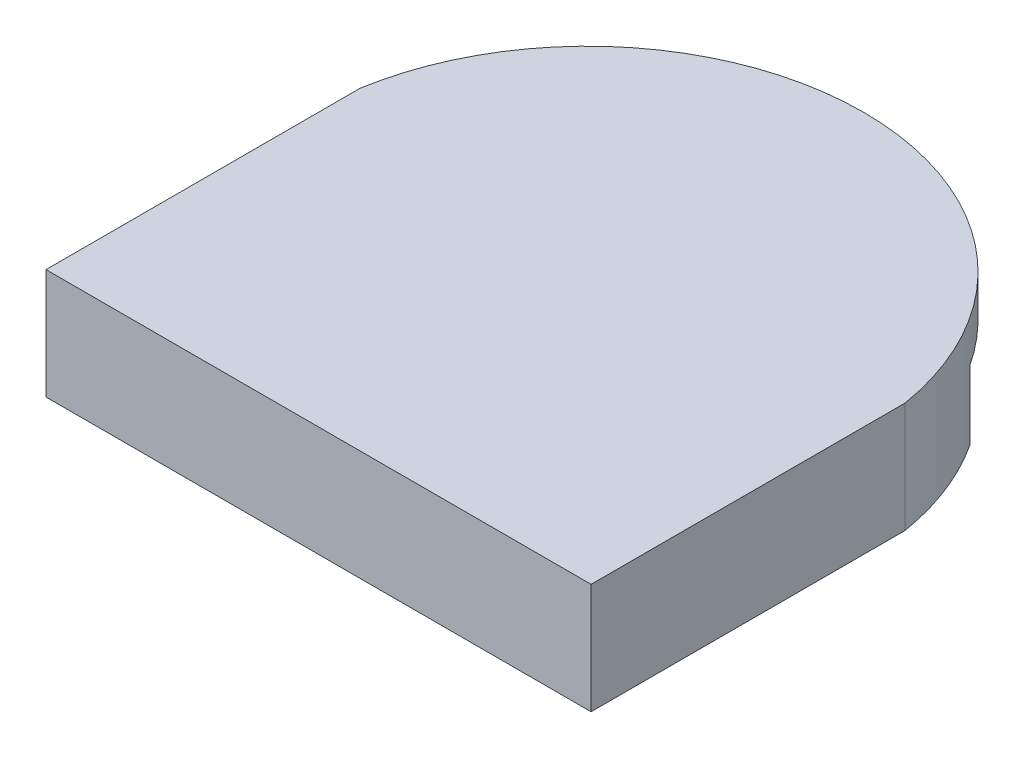
ISO-10303-21;
HEADER;
FILE_DESCRIPTION(('STEP AP214'),'2;1');
FILE_NAME('part.step','',(''),(''),'','','');
FILE_SCHEMA(('AUTOMOTIVE_DESIGN { 1 0 10303 214 1 1 1 1 }'));
ENDSEC;
DATA;
#1=APPLICATION_CONTEXT('core data for automotive mechanical design processes');
#2=APPLICATION_PROTOCOL_DEFINITION('international standard','automotive_design',2000,#1);
#3=PRODUCT_CONTEXT('',#1,'mechanical');
#4=PRODUCT('Part','Part','',(#3));
#5=PRODUCT_RELATED_PRODUCT_CATEGORY('part','',(#4));
#6=PRODUCT_DEFINITION_FORMATION('','',#4);
#7=PRODUCT_DEFINITION_CONTEXT('part definition',#1,'design');
#8=PRODUCT_DEFINITION('design','',#6,#7);
#9=PRODUCT_DEFINITION_SHAPE('','',#8);
#10=(LENGTH_UNIT() NAMED_UNIT(*) SI_UNIT(.MILLI.,.METRE.));
#11=(NAMED_UNIT(*) PLANE_ANGLE_UNIT() SI_UNIT($,.RADIAN.));
#12=(NAMED_UNIT(*) SI_UNIT($,.STERADIAN.) SOLID_ANGLE_UNIT());
#13=UNCERTAINTY_MEASURE_WITH_UNIT(LENGTH_MEASURE(1.E-05),#10,'distance_accuracy_value','');
#14=(GEOMETRIC_REPRESENTATION_CONTEXT(3) GLOBAL_UNCERTAINTY_ASSIGNED_CONTEXT((#13)) GLOBAL_UNIT_ASSIGNED_CONTEXT((#10,
#11,#12)) REPRESENTATION_CONTEXT('',''));
#15=CARTESIAN_POINT('',(0.,0.,0.));
#16=DIRECTION('',(0.,0.,1.));
#17=DIRECTION('',(1.,0.,0.));
#18=AXIS2_PLACEMENT_3D('',#15,#16,#17);
#19=CARTESIAN_POINT('',(1.88196721311474,0.,7.9));
#20=DIRECTION('',(1.,0.,0.));
#21=DIRECTION('',(0.,0.,-1.));
#22=AXIS2_PLACEMENT_3D('',#19,#20,#21);
#23=PLANE('',#22);
#24=DIRECTION('',(0.,0.,-1.));
#25=VECTOR('',#24,1.);
#26=CARTESIAN_POINT('',(1.88196721311474,0.,7.9));
#27=LINE('',#26,#25);
#28=CARTESIAN_POINT('',(1.88196721311474,0.,6.7));
#29=VERTEX_POINT('',#28);
#30=CARTESIAN_POINT('',(1.88196721311474,0.,0.));
#31=VERTEX_POINT('',#30);
#32=EDGE_CURVE('E272',#29,#31,#27,.T.);
#33=ORIENTED_EDGE('',*,*,#32,.T.);
#34=DIRECTION('',(0.,1.,0.));
#35=VECTOR('',#34,1.);
#36=CARTESIAN_POINT('',(1.88196721311474,0.,0.));
#37=LINE('',#36,#35);
#38=CARTESIAN_POINT('',(1.88196721311474,2.,0.));
#39=VERTEX_POINT('',#38);
#40=EDGE_CURVE('E191',#31,#39,#37,.T.);
#41=ORIENTED_EDGE('',*,*,#40,.T.);
#42=DIRECTION('',(0.,0.,-1.));
#43=VECTOR('',#42,1.);
#44=CARTESIAN_POINT('',(1.88196721311474,2.,7.9));
#45=LINE('',#44,#43);
#46=CARTESIAN_POINT('',(1.88196721311474,2.,6.7));
#47=VERTEX_POINT('',#46);
#48=EDGE_CURVE('E262',#47,#39,#45,.T.);
#49=ORIENTED_EDGE('',*,*,#48,.F.);
#50=DIRECTION('',(0.,-1.,0.));
#51=VECTOR('',#50,1.);
#52=CARTESIAN_POINT('',(1.88196721311474,0.,6.7));
#53=LINE('',#52,#51);
#54=EDGE_CURVE('E259',#47,#29,#53,.T.);
#55=ORIENTED_EDGE('',*,*,#54,.T.);
#56=EDGE_LOOP('',(#33,#41,#49,#55));
#57=FACE_BOUND('',#56,.T.);
#58=ADVANCED_FACE('F41',(#57),#23,.T.);
#59=CARTESIAN_POINT('',(0.681967213114738,2.,7.9));
#60=DIRECTION('',(0.,-1.,0.));
#61=DIRECTION('',(1.,0.,0.));
#62=AXIS2_PLACEMENT_3D('',#59,#60,#61);
#63=PLANE('',#62);
#64=DIRECTION('',(-0.707106781186548,0.,-0.707106781186548));
#65=VECTOR('',#64,1.);
#66=CARTESIAN_POINT('',(4.36541319002874,2.,-6.7));
#67=LINE('',#66,#65);
#68=CARTESIAN_POINT('',(5.24962682858902,2.,-5.81578636143971));
#69=VERTEX_POINT('',#68);
#70=CARTESIAN_POINT('',(4.36541319002874,2.,-6.7));
#71=VERTEX_POINT('',#70);
#72=EDGE_CURVE('E182',#69,#71,#67,.T.);
#73=ORIENTED_EDGE('',*,*,#72,.F.);
#74=CARTESIAN_POINT('',(8.57559311453201,2.,-0.00261129878219996));
#75=DIRECTION('',(0.,1.,0.));
#76=DIRECTION('',(0.,0.,-1.));
#77=AXIS2_PLACEMENT_3D('',#74,#75,#76);
#78=CIRCLE('',#77,6.69739173442413);
#79=CARTESIAN_POINT('',(8.58196721311474,2.,-6.7));
#80=VERTEX_POINT('',#79);
#81=EDGE_CURVE('E64',#80,#69,#78,.T.);
#82=ORIENTED_EDGE('',*,*,#81,.F.);
#83=CARTESIAN_POINT('',(8.58196721311474,2.,0.));
#84=DIRECTION('',(0.,1.,0.));
#85=DIRECTION('',(0.,0.,1.));
#86=AXIS2_PLACEMENT_3D('',#83,#84,#85);
#87=CIRCLE('',#86,6.7);
#88=CARTESIAN_POINT('',(11.9122376651536,2.,-5.81371642895289));
#89=VERTEX_POINT('',#88);
#90=EDGE_CURVE('E201',#89,#80,#87,.T.);
#91=ORIENTED_EDGE('',*,*,#90,.F.);
#92=DIRECTION('',(-0.707106781186547,0.,0.707106781186548));
#93=VECTOR('',#92,1.);
#94=CARTESIAN_POINT('',(12.7985212362007,2.,-6.7));
#95=LINE('',#94,#93);
#96=CARTESIAN_POINT('',(12.7985212362007,2.,-6.7));
#97=VERTEX_POINT('',#96);
#98=EDGE_CURVE('E206',#97,#89,#95,.T.);
#99=ORIENTED_EDGE('',*,*,#98,.F.);
#100=CARTESIAN_POINT('',(8.58196721311474,2.,0.108053262334495));
#101=DIRECTION('',(0.,-1.,0.));
#102=DIRECTION('',(1.,0.,0.));
#103=AXIS2_PLACEMENT_3D('',#100,#101,#102);
#104=CIRCLE('',#103,8.0080532623345);
#105=CARTESIAN_POINT('',(15.2819672131147,2.,-4.27816573041839));
#106=VERTEX_POINT('',#105);
#107=EDGE_CURVE('E247',#106,#97,#104,.F.);
#108=ORIENTED_EDGE('',*,*,#107,.F.);
#109=DIRECTION('',(0.707106781186547,0.,-0.707106781186548));
#110=VECTOR('',#109,1.);
#111=CARTESIAN_POINT('',(15.2819672131147,2.,-4.27816573041839));
#112=LINE('',#111,#110);
#113=CARTESIAN_POINT('',(14.3731332158897,2.,-3.36933173319334));
#114=VERTEX_POINT('',#113);
#115=EDGE_CURVE('E222',#114,#106,#112,.T.);
#116=ORIENTED_EDGE('',*,*,#115,.F.);
#117=CARTESIAN_POINT('',(8.58196721311474,2.,0.));
#118=DIRECTION('',(0.,1.,0.));
#119=DIRECTION('',(0.,0.,1.));
#120=AXIS2_PLACEMENT_3D('',#117,#118,#119);
#121=CIRCLE('',#120,6.7);
#122=CARTESIAN_POINT('',(15.2819672131147,2.,0.));
#123=VERTEX_POINT('',#122);
#124=EDGE_CURVE('E215',#123,#114,#121,.T.);
#125=ORIENTED_EDGE('',*,*,#124,.F.);
#126=DIRECTION('',(0.,0.,-1.));
#127=VECTOR('',#126,1.);
#128=CARTESIAN_POINT('',(15.2819672131147,2.,7.9));
#129=LINE('',#128,#127);
#130=CARTESIAN_POINT('',(15.2819672131147,2.,6.7));
#131=VERTEX_POINT('',#130);
#132=EDGE_CURVE('E265',#131,#123,#129,.T.);
#133=ORIENTED_EDGE('',*,*,#132,.F.);
#134=DIRECTION('',(-1.,0.,0.));
#135=VECTOR('',#134,1.);
#136=CARTESIAN_POINT('',(0.,2.,6.7));
#137=LINE('',#136,#135);
#138=EDGE_CURVE('E266',#131,#47,#137,.T.);
#139=ORIENTED_EDGE('',*,*,#138,.T.);
#140=ORIENTED_EDGE('',*,*,#48,.T.);
#141=CARTESIAN_POINT('',(8.58196721311475,2.,0.));
#142=DIRECTION('',(0.,1.,0.));
#143=DIRECTION('',(0.,0.,-1.));
#144=AXIS2_PLACEMENT_3D('',#141,#142,#143);
#145=CIRCLE('',#144,6.70000000000001);
#146=CARTESIAN_POINT('',(2.79080121033979,2.,-3.36933173319334));
#147=VERTEX_POINT('',#146);
#148=EDGE_CURVE('E56',#147,#39,#145,.T.);
#149=ORIENTED_EDGE('',*,*,#148,.F.);
#150=DIRECTION('',(0.707106781186547,0.,0.707106781186548));
#151=VECTOR('',#150,1.);
#152=CARTESIAN_POINT('',(1.88196721311474,2.,-4.27816573041839));
#153=LINE('',#152,#151);
#154=CARTESIAN_POINT('',(1.88196721311474,2.,-4.27816573041839));
#155=VERTEX_POINT('',#154);
#156=EDGE_CURVE('E194',#155,#147,#153,.T.);
#157=ORIENTED_EDGE('',*,*,#156,.F.);
#158=CARTESIAN_POINT('',(8.58196721311474,2.,0.108053262334495));
#159=DIRECTION('',(0.,-1.,0.));
#160=DIRECTION('',(1.,0.,0.));
#161=AXIS2_PLACEMENT_3D('',#158,#159,#160);
#162=CIRCLE('',#161,8.0080532623345);
#163=EDGE_CURVE('E234',#155,#71,#162,.T.);
#164=ORIENTED_EDGE('',*,*,#163,.T.);
#165=EDGE_LOOP('',(#73,#82,#91,#99,#108,#116,#125,#133,#139,#140,#149,#157,#164));
#166=FACE_BOUND('',#165,.T.);
#167=CARTESIAN_POINT('',(8.58196721311474,2.,0.));
#168=DIRECTION('',(0.,-1.,0.));
#169=DIRECTION('',(1.,0.,0.));
#170=AXIS2_PLACEMENT_3D('',#167,#168,#169);
#171=CIRCLE('',#170,3.15);
#172=CARTESIAN_POINT('',(11.7319672131147,2.,0.));
#173=VERTEX_POINT('',#172);
#174=EDGE_CURVE('E258',#173,#173,#171,.F.);
#175=ORIENTED_EDGE('',*,*,#174,.T.);
#176=EDGE_LOOP('',(#175));
#177=FACE_BOUND('',#176,.T.);
#178=ADVANCED_FACE('F311',(#166,#177),#63,.T.);
#179=CARTESIAN_POINT('',(0.681967213114738,0.,7.9));
#180=DIRECTION('',(0.,1.,0.));
#181=DIRECTION('',(0.,0.,1.));
#182=AXIS2_PLACEMENT_3D('',#179,#180,#181);
#183=PLANE('',#182);
#184=CARTESIAN_POINT('',(8.58196721311474,0.,0.));
#185=DIRECTION('',(0.,1.,0.));
#186=DIRECTION('',(0.,0.,1.));
#187=AXIS2_PLACEMENT_3D('',#184,#185,#186);
#188=CIRCLE('',#187,6.7);
#189=CARTESIAN_POINT('',(11.9122376651536,0.,-5.81371642895289));
#190=VERTEX_POINT('',#189);
#191=CARTESIAN_POINT('',(8.58196721311474,0.,-6.7));
#192=VERTEX_POINT('',#191);
#193=EDGE_CURVE('E176',#190,#192,#188,.T.);
#194=ORIENTED_EDGE('',*,*,#193,.T.);
#195=CARTESIAN_POINT('',(8.57559311453201,0.,-0.00261129878219996));
#196=DIRECTION('',(0.,1.,0.));
#197=DIRECTION('',(0.,0.,-1.));
#198=AXIS2_PLACEMENT_3D('',#195,#196,#197);
#199=CIRCLE('',#198,6.69739173442413);
#200=CARTESIAN_POINT('',(5.24962682858902,0.,-5.81578636143971));
#201=VERTEX_POINT('',#200);
#202=EDGE_CURVE('E171',#192,#201,#199,.T.);
#203=ORIENTED_EDGE('',*,*,#202,.T.);
#204=DIRECTION('',(-0.707106781186548,0.,-0.707106781186548));
#205=VECTOR('',#204,1.);
#206=CARTESIAN_POINT('',(4.36541319002874,0.,-6.7));
#207=LINE('',#206,#205);
#208=CARTESIAN_POINT('',(4.36541319002874,0.,-6.7));
#209=VERTEX_POINT('',#208);
#210=EDGE_CURVE('E163',#201,#209,#207,.T.);
#211=ORIENTED_EDGE('',*,*,#210,.T.);
#212=CARTESIAN_POINT('',(8.58196721311474,0.,0.108053262334495));
#213=DIRECTION('',(0.,-1.,0.));
#214=DIRECTION('',(0.,0.,1.));
#215=AXIS2_PLACEMENT_3D('',#212,#213,#214);
#216=CIRCLE('',#215,8.0080532623345);
#217=CARTESIAN_POINT('',(12.7985212362007,0.,-6.7));
#218=VERTEX_POINT('',#217);
#219=EDGE_CURVE('E240',#209,#218,#216,.T.);
#220=ORIENTED_EDGE('',*,*,#219,.T.);
#221=DIRECTION('',(-0.707106781186547,0.,0.707106781186548));
#222=VECTOR('',#221,1.);
#223=CARTESIAN_POINT('',(12.7985212362007,0.,-6.7));
#224=LINE('',#223,#222);
#225=EDGE_CURVE('E200',#218,#190,#224,.T.);
#226=ORIENTED_EDGE('',*,*,#225,.T.);
#227=EDGE_LOOP('',(#194,#203,#211,#220,#226));
#228=FACE_BOUND('',#227,.T.);
#229=ADVANCED_FACE('F174',(#228),#183,.F.);
#230=CARTESIAN_POINT('',(8.58196721311474,0.,0.108053262334495));
#231=DIRECTION('',(0.,1.,0.));
#232=DIRECTION('',(0.,0.,1.));
#233=AXIS2_PLACEMENT_3D('',#230,#231,#232);
#234=CIRCLE('',#233,8.0080532623345);
#235=CARTESIAN_POINT('',(1.88196721311474,0.,-4.27816573041839));
#236=VERTEX_POINT('',#235);
#237=CARTESIAN_POINT('',(0.68196721311474,0.,-1.20302150761043));
#238=VERTEX_POINT('',#237);
#239=EDGE_CURVE('E229',#236,#238,#234,.T.);
#240=ORIENTED_EDGE('',*,*,#239,.F.);
#241=DIRECTION('',(0.707106781186547,0.,0.707106781186548));
#242=VECTOR('',#241,1.);
#243=CARTESIAN_POINT('',(1.88196721311474,0.,-4.27816573041839));
#244=LINE('',#243,#242);
#245=CARTESIAN_POINT('',(2.79080121033979,0.,-3.36933173319334));
#246=VERTEX_POINT('',#245);
#247=EDGE_CURVE('E189',#236,#246,#244,.T.);
#248=ORIENTED_EDGE('',*,*,#247,.T.);
#249=CARTESIAN_POINT('',(8.58196721311475,0.,0.));
#250=DIRECTION('',(0.,1.,0.));
#251=DIRECTION('',(0.,0.,-1.));
#252=AXIS2_PLACEMENT_3D('',#249,#250,#251);
#253=CIRCLE('',#252,6.70000000000001);
#254=EDGE_CURVE('E184',#246,#31,#253,.T.);
#255=ORIENTED_EDGE('',*,*,#254,.T.);
#256=ORIENTED_EDGE('',*,*,#32,.F.);
#257=DIRECTION('',(1.,0.,0.));
#258=VECTOR('',#257,1.);
#259=CARTESIAN_POINT('',(0.,0.,6.7));
#260=LINE('',#259,#258);
#261=CARTESIAN_POINT('',(15.2819672131147,0.,6.7));
#262=VERTEX_POINT('',#261);
#263=EDGE_CURVE('E261',#29,#262,#260,.T.);
#264=ORIENTED_EDGE('',*,*,#263,.T.);
#265=DIRECTION('',(0.,0.,-1.));
#266=VECTOR('',#265,1.);
#267=CARTESIAN_POINT('',(15.2819672131147,0.,7.9));
#268=LINE('',#267,#266);
#269=CARTESIAN_POINT('',(15.2819672131147,0.,0.));
#270=VERTEX_POINT('',#269);
#271=EDGE_CURVE('E270',#262,#270,#268,.T.);
#272=ORIENTED_EDGE('',*,*,#271,.T.);
#273=CARTESIAN_POINT('',(8.58196721311474,0.,0.));
#274=DIRECTION('',(0.,1.,0.));
#275=DIRECTION('',(0.,0.,1.));
#276=AXIS2_PLACEMENT_3D('',#273,#274,#275);
#277=CIRCLE('',#276,6.7);
#278=CARTESIAN_POINT('',(14.3731332158897,0.,-3.36933173319334));
#279=VERTEX_POINT('',#278);
#280=EDGE_CURVE('E211',#270,#279,#277,.T.);
#281=ORIENTED_EDGE('',*,*,#280,.T.);
#282=DIRECTION('',(0.707106781186547,0.,-0.707106781186548));
#283=VECTOR('',#282,1.);
#284=CARTESIAN_POINT('',(15.2819672131147,0.,-4.27816573041839));
#285=LINE('',#284,#283);
#286=CARTESIAN_POINT('',(15.2819672131147,0.,-4.27816573041839));
#287=VERTEX_POINT('',#286);
#288=EDGE_CURVE('E214',#279,#287,#285,.T.);
#289=ORIENTED_EDGE('',*,*,#288,.T.);
#290=CARTESIAN_POINT('',(16.4819672131147,0.,-1.20302150761043));
#291=VERTEX_POINT('',#290);
#292=EDGE_CURVE('E243',#287,#291,#216,.T.);
#293=ORIENTED_EDGE('',*,*,#292,.T.);
#294=DIRECTION('',(0.,0.,-1.));
#295=VECTOR('',#294,1.);
#296=CARTESIAN_POINT('',(16.4819672131147,0.,7.9));
#297=LINE('',#296,#295);
#298=CARTESIAN_POINT('',(16.4819672131147,0.,7.9));
#299=VERTEX_POINT('',#298);
#300=EDGE_CURVE('E294',#299,#291,#297,.T.);
#301=ORIENTED_EDGE('',*,*,#300,.F.);
#302=DIRECTION('',(1.,0.,0.));
#303=VECTOR('',#302,1.);
#304=CARTESIAN_POINT('',(0.681967213114738,0.,7.9));
#305=LINE('',#304,#303);
#306=CARTESIAN_POINT('',(0.681967213114738,0.,7.9));
#307=VERTEX_POINT('',#306);
#308=EDGE_CURVE('E282',#307,#299,#305,.T.);
#309=ORIENTED_EDGE('',*,*,#308,.F.);
#310=DIRECTION('',(0.,0.,-1.));
#311=VECTOR('',#310,1.);
#312=CARTESIAN_POINT('',(0.681967213114738,0.,7.9));
#313=LINE('',#312,#311);
#314=EDGE_CURVE('E297',#307,#238,#313,.T.);
#315=ORIENTED_EDGE('',*,*,#314,.T.);
#316=EDGE_LOOP('',(#240,#248,#255,#256,#264,#272,#281,#289,#293,#301,#309,#315));
#317=FACE_BOUND('',#316,.T.);
#318=ADVANCED_FACE('F329',(#317),#183,.F.);
#319=CARTESIAN_POINT('',(0.681967213114738,0.,7.9));
#320=DIRECTION('',(1.,0.,0.));
#321=DIRECTION('',(0.,0.,-1.));
#322=AXIS2_PLACEMENT_3D('',#319,#320,#321);
#323=PLANE('',#322);
#324=DIRECTION('',(0.,1.,0.));
#325=VECTOR('',#324,1.);
#326=CARTESIAN_POINT('',(0.68196721311474,0.,-1.20302150761043));
#327=LINE('',#326,#325);
#328=CARTESIAN_POINT('',(0.68196721311474,3.2,-1.20302150761043));
#329=VERTEX_POINT('',#328);
#330=EDGE_CURVE('E231',#238,#329,#327,.T.);
#331=ORIENTED_EDGE('',*,*,#330,.F.);
#332=ORIENTED_EDGE('',*,*,#314,.F.);
#333=DIRECTION('',(0.,-1.,0.));
#334=VECTOR('',#333,1.);
#335=CARTESIAN_POINT('',(0.681967213114738,0.,7.9));
#336=LINE('',#335,#334);
#337=CARTESIAN_POINT('',(0.681967213114738,3.2,7.9));
#338=VERTEX_POINT('',#337);
#339=EDGE_CURVE('E275',#338,#307,#336,.T.);
#340=ORIENTED_EDGE('',*,*,#339,.F.);
#341=DIRECTION('',(0.,0.,-1.));
#342=VECTOR('',#341,1.);
#343=CARTESIAN_POINT('',(0.681967213114738,3.2,7.9));
#344=LINE('',#343,#342);
#345=EDGE_CURVE('E288',#338,#329,#344,.T.);
#346=ORIENTED_EDGE('',*,*,#345,.T.);
#347=EDGE_LOOP('',(#331,#332,#340,#346));
#348=FACE_BOUND('',#347,.T.);
#349=ADVANCED_FACE('F43',(#348),#323,.F.);
#350=CARTESIAN_POINT('',(0.681967213114738,3.2,7.9));
#351=DIRECTION('',(0.,-1.,0.));
#352=DIRECTION('',(1.,0.,0.));
#353=AXIS2_PLACEMENT_3D('',#350,#351,#352);
#354=PLANE('',#353);
#355=CARTESIAN_POINT('',(8.58196721311474,3.2,0.108053262334495));
#356=DIRECTION('',(0.,-1.,0.));
#357=DIRECTION('',(0.,0.,1.));
#358=AXIS2_PLACEMENT_3D('',#355,#356,#357);
#359=CIRCLE('',#358,8.0080532623345);
#360=CARTESIAN_POINT('',(16.4819672131147,3.2,-1.20302150761043));
#361=VERTEX_POINT('',#360);
#362=EDGE_CURVE('E239',#329,#361,#359,.T.);
#363=ORIENTED_EDGE('',*,*,#362,.F.);
#364=ORIENTED_EDGE('',*,*,#345,.F.);
#365=DIRECTION('',(-1.,0.,0.));
#366=VECTOR('',#365,1.);
#367=CARTESIAN_POINT('',(0.681967213114738,3.2,7.9));
#368=LINE('',#367,#366);
#369=CARTESIAN_POINT('',(16.4819672131147,3.2,7.9));
#370=VERTEX_POINT('',#369);
#371=EDGE_CURVE('E286',#370,#338,#368,.T.);
#372=ORIENTED_EDGE('',*,*,#371,.F.);
#373=DIRECTION('',(0.,0.,-1.));
#374=VECTOR('',#373,1.);
#375=CARTESIAN_POINT('',(16.4819672131147,3.2,7.9));
#376=LINE('',#375,#374);
#377=EDGE_CURVE('E291',#370,#361,#376,.T.);
#378=ORIENTED_EDGE('',*,*,#377,.T.);
#379=EDGE_LOOP('',(#363,#364,#372,#378));
#380=FACE_BOUND('',#379,.T.);
#381=ADVANCED_FACE('F382',(#380),#354,.F.);
#382=CARTESIAN_POINT('',(16.4819672131147,0.,7.9));
#383=DIRECTION('',(-1.,0.,0.));
#384=DIRECTION('',(0.,0.,1.));
#385=AXIS2_PLACEMENT_3D('',#382,#383,#384);
#386=PLANE('',#385);
#387=ORIENTED_EDGE('',*,*,#300,.T.);
#388=DIRECTION('',(0.,1.,0.));
#389=VECTOR('',#388,1.);
#390=CARTESIAN_POINT('',(16.4819672131147,0.,-1.20302150761043));
#391=LINE('',#390,#389);
#392=EDGE_CURVE('E242',#291,#361,#391,.T.);
#393=ORIENTED_EDGE('',*,*,#392,.T.);
#394=ORIENTED_EDGE('',*,*,#377,.F.);
#395=DIRECTION('',(0.,1.,0.));
#396=VECTOR('',#395,1.);
#397=CARTESIAN_POINT('',(16.4819672131147,0.,7.9));
#398=LINE('',#397,#396);
#399=EDGE_CURVE('E284',#299,#370,#398,.T.);
#400=ORIENTED_EDGE('',*,*,#399,.F.);
#401=EDGE_LOOP('',(#387,#393,#394,#400));
#402=FACE_BOUND('',#401,.T.);
#403=ADVANCED_FACE('F380',(#402),#386,.F.);
#404=CARTESIAN_POINT('',(0.,0.,7.9));
#405=DIRECTION('',(0.,0.,-1.));
#406=DIRECTION('',(-1.,0.,0.));
#407=AXIS2_PLACEMENT_3D('',#404,#405,#406);
#408=PLANE('',#407);
#409=ORIENTED_EDGE('',*,*,#339,.T.);
#410=ORIENTED_EDGE('',*,*,#308,.T.);
#411=ORIENTED_EDGE('',*,*,#399,.T.);
#412=ORIENTED_EDGE('',*,*,#371,.T.);
#413=EDGE_LOOP('',(#409,#410,#411,#412));
#414=FACE_BOUND('',#413,.T.);
#415=ADVANCED_FACE('F373',(#414),#408,.F.);
#416=CARTESIAN_POINT('',(15.2819672131147,0.,7.9));
#417=DIRECTION('',(-1.,0.,0.));
#418=DIRECTION('',(0.,0.,1.));
#419=AXIS2_PLACEMENT_3D('',#416,#417,#418);
#420=PLANE('',#419);
#421=DIRECTION('',(0.,1.,0.));
#422=VECTOR('',#421,1.);
#423=CARTESIAN_POINT('',(15.2819672131147,0.,0.));
#424=LINE('',#423,#422);
#425=EDGE_CURVE('E219',#270,#123,#424,.T.);
#426=ORIENTED_EDGE('',*,*,#425,.F.);
#427=ORIENTED_EDGE('',*,*,#271,.F.);
#428=DIRECTION('',(0.,1.,0.));
#429=VECTOR('',#428,1.);
#430=CARTESIAN_POINT('',(15.2819672131147,0.,6.7));
#431=LINE('',#430,#429);
#432=EDGE_CURVE('E268',#262,#131,#431,.T.);
#433=ORIENTED_EDGE('',*,*,#432,.T.);
#434=ORIENTED_EDGE('',*,*,#132,.T.);
#435=EDGE_LOOP('',(#426,#427,#433,#434));
#436=FACE_BOUND('',#435,.T.);
#437=ADVANCED_FACE('F325',(#436),#420,.T.);
#438=CARTESIAN_POINT('',(0.,0.,6.7));
#439=DIRECTION('',(0.,0.,-1.));
#440=DIRECTION('',(-1.,0.,0.));
#441=AXIS2_PLACEMENT_3D('',#438,#439,#440);
#442=PLANE('',#441);
#443=ORIENTED_EDGE('',*,*,#54,.F.);
#444=ORIENTED_EDGE('',*,*,#138,.F.);
#445=ORIENTED_EDGE('',*,*,#432,.F.);
#446=ORIENTED_EDGE('',*,*,#263,.F.);
#447=EDGE_LOOP('',(#443,#444,#445,#446));
#448=FACE_BOUND('',#447,.T.);
#449=ADVANCED_FACE('F334',(#448),#442,.T.);
#450=CARTESIAN_POINT('',(8.58196721311474,0.6,0.));
#451=DIRECTION('',(0.,-1.,0.));
#452=DIRECTION('',(0.,0.,-1.));
#453=AXIS2_PLACEMENT_3D('',#450,#451,#452);
#454=PLANE('',#453);
#455=CARTESIAN_POINT('',(8.58196721311474,0.6,0.));
#456=DIRECTION('',(0.,-1.,0.));
#457=DIRECTION('',(0.,0.,-1.));
#458=AXIS2_PLACEMENT_3D('',#455,#456,#457);
#459=CIRCLE('',#458,3.15);
#460=CARTESIAN_POINT('',(8.58196721311474,0.6,-3.15));
#461=VERTEX_POINT('',#460);
#462=EDGE_CURVE('E255',#461,#461,#459,.T.);
#463=ORIENTED_EDGE('',*,*,#462,.T.);
#464=EDGE_LOOP('',(#463));
#465=FACE_BOUND('',#464,.T.);
#466=CARTESIAN_POINT('',(8.58196721311474,0.6,0.));
#467=DIRECTION('',(0.,-1.,0.));
#468=DIRECTION('',(0.,0.,-1.));
#469=AXIS2_PLACEMENT_3D('',#466,#467,#468);
#470=CIRCLE('',#469,2.4);
#471=CARTESIAN_POINT('',(8.58196721311474,0.6,-2.4));
#472=VERTEX_POINT('',#471);
#473=EDGE_CURVE('E252',#472,#472,#470,.T.);
#474=ORIENTED_EDGE('',*,*,#473,.F.);
#475=EDGE_LOOP('',(#474));
#476=FACE_BOUND('',#475,.T.);
#477=ADVANCED_FACE('F377',(#465,#476),#454,.T.);
#478=CARTESIAN_POINT('',(8.58196721311474,0.6,0.));
#479=DIRECTION('',(0.,1.,0.));
#480=DIRECTION('',(0.,0.,1.));
#481=AXIS2_PLACEMENT_3D('',#478,#479,#480);
#482=CYLINDRICAL_SURFACE('',#481,3.15);
#483=ORIENTED_EDGE('',*,*,#174,.F.);
#484=EDGE_LOOP('',(#483));
#485=FACE_BOUND('',#484,.T.);
#486=ORIENTED_EDGE('',*,*,#462,.F.);
#487=EDGE_LOOP('',(#486));
#488=FACE_BOUND('',#487,.T.);
#489=ADVANCED_FACE('F370',(#485,#488),#482,.T.);
#490=CARTESIAN_POINT('',(8.58196721311474,0.6,0.));
#491=DIRECTION('',(0.,1.,0.));
#492=DIRECTION('',(0.,0.,1.));
#493=AXIS2_PLACEMENT_3D('',#490,#491,#492);
#494=CYLINDRICAL_SURFACE('',#493,2.4);
#495=CARTESIAN_POINT('',(8.58196721311474,2.,0.));
#496=DIRECTION('',(0.,-1.,0.));
#497=DIRECTION('',(1.,0.,0.));
#498=AXIS2_PLACEMENT_3D('',#495,#496,#497);
#499=CIRCLE('',#498,2.4);
#500=CARTESIAN_POINT('',(10.9819672131147,2.,0.));
#501=VERTEX_POINT('',#500);
#502=EDGE_CURVE('E300',#501,#501,#499,.F.);
#503=ORIENTED_EDGE('',*,*,#502,.T.);
#504=EDGE_LOOP('',(#503));
#505=FACE_BOUND('',#504,.T.);
#506=ORIENTED_EDGE('',*,*,#473,.T.);
#507=EDGE_LOOP('',(#506));
#508=FACE_BOUND('',#507,.T.);
#509=ADVANCED_FACE('F533',(#505,#508),#494,.F.);
#510=ORIENTED_EDGE('',*,*,#502,.F.);
#511=EDGE_LOOP('',(#510));
#512=FACE_BOUND('',#511,.T.);
#513=ADVANCED_FACE('F367',(#512),#63,.T.);
#514=CARTESIAN_POINT('',(8.58196721311474,0.,0.108053262334495));
#515=DIRECTION('',(0.,1.,0.));
#516=DIRECTION('',(0.,0.,1.));
#517=AXIS2_PLACEMENT_3D('',#514,#515,#516);
#518=CYLINDRICAL_SURFACE('',#517,8.0080532623345);
#519=DIRECTION('',(0.,1.,0.));
#520=VECTOR('',#519,1.);
#521=CARTESIAN_POINT('',(15.2819672131147,0.,-4.27816573041839));
#522=LINE('',#521,#520);
#523=EDGE_CURVE('E250',#287,#106,#522,.T.);
#524=ORIENTED_EDGE('',*,*,#523,.T.);
#525=ORIENTED_EDGE('',*,*,#107,.T.);
#526=DIRECTION('',(0.,1.,0.));
#527=VECTOR('',#526,1.);
#528=CARTESIAN_POINT('',(12.7985212362007,0.,-6.7));
#529=LINE('',#528,#527);
#530=EDGE_CURVE('E49',#218,#97,#529,.T.);
#531=ORIENTED_EDGE('',*,*,#530,.F.);
#532=ORIENTED_EDGE('',*,*,#219,.F.);
#533=DIRECTION('',(0.,1.,0.));
#534=VECTOR('',#533,1.);
#535=CARTESIAN_POINT('',(4.36541319002874,0.,-6.7));
#536=LINE('',#535,#534);
#537=EDGE_CURVE('E11',#209,#71,#536,.T.);
#538=ORIENTED_EDGE('',*,*,#537,.T.);
#539=ORIENTED_EDGE('',*,*,#163,.F.);
#540=DIRECTION('',(0.,1.,0.));
#541=VECTOR('',#540,1.);
#542=CARTESIAN_POINT('',(1.88196721311474,0.,-4.27816573041838));
#543=LINE('',#542,#541);
#544=EDGE_CURVE('E237',#236,#155,#543,.T.);
#545=ORIENTED_EDGE('',*,*,#544,.F.);
#546=ORIENTED_EDGE('',*,*,#239,.T.);
#547=ORIENTED_EDGE('',*,*,#330,.T.);
#548=ORIENTED_EDGE('',*,*,#362,.T.);
#549=ORIENTED_EDGE('',*,*,#392,.F.);
#550=ORIENTED_EDGE('',*,*,#292,.F.);
#551=EDGE_LOOP('',(#524,#525,#531,#532,#538,#539,#545,#546,#547,#548,#549,#550));
#552=FACE_BOUND('',#551,.T.);
#553=ADVANCED_FACE('F313',(#552),#518,.T.);
#554=CARTESIAN_POINT('',(8.58196721311474,0.,0.));
#555=DIRECTION('',(0.,1.,0.));
#556=DIRECTION('',(0.,0.,1.));
#557=AXIS2_PLACEMENT_3D('',#554,#555,#556);
#558=CYLINDRICAL_SURFACE('',#557,6.7);
#559=DIRECTION('',(0.,1.,0.));
#560=VECTOR('',#559,1.);
#561=CARTESIAN_POINT('',(14.3731332158897,0.,-3.36933173319334));
#562=LINE('',#561,#560);
#563=EDGE_CURVE('E218',#279,#114,#562,.T.);
#564=ORIENTED_EDGE('',*,*,#563,.F.);
#565=ORIENTED_EDGE('',*,*,#280,.F.);
#566=ORIENTED_EDGE('',*,*,#425,.T.);
#567=ORIENTED_EDGE('',*,*,#124,.T.);
#568=EDGE_LOOP('',(#564,#565,#566,#567));
#569=FACE_BOUND('',#568,.T.);
#570=ADVANCED_FACE('F322',(#569),#558,.F.);
#571=CARTESIAN_POINT('',(15.2819672131147,0.,-4.27816573041839));
#572=DIRECTION('',(0.707106781186548,0.,0.707106781186547));
#573=DIRECTION('',(0.707106781186547,0.,-0.707106781186548));
#574=AXIS2_PLACEMENT_3D('',#571,#572,#573);
#575=PLANE('',#574);
#576=ORIENTED_EDGE('',*,*,#523,.F.);
#577=ORIENTED_EDGE('',*,*,#288,.F.);
#578=ORIENTED_EDGE('',*,*,#563,.T.);
#579=ORIENTED_EDGE('',*,*,#115,.T.);
#580=EDGE_LOOP('',(#576,#577,#578,#579));
#581=FACE_BOUND('',#580,.T.);
#582=ADVANCED_FACE('F317',(#581),#575,.F.);
#583=CARTESIAN_POINT('',(8.58196721311474,0.,0.));
#584=DIRECTION('',(0.,1.,0.));
#585=DIRECTION('',(0.,0.,1.));
#586=AXIS2_PLACEMENT_3D('',#583,#584,#585);
#587=CYLINDRICAL_SURFACE('',#586,6.7);
#588=DIRECTION('',(0.,1.,0.));
#589=VECTOR('',#588,1.);
#590=CARTESIAN_POINT('',(8.58196721311474,0.,-6.7));
#591=LINE('',#590,#589);
#592=EDGE_CURVE('E203',#192,#80,#591,.T.);
#593=ORIENTED_EDGE('',*,*,#592,.F.);
#594=ORIENTED_EDGE('',*,*,#193,.F.);
#595=DIRECTION('',(0.,1.,0.));
#596=VECTOR('',#595,1.);
#597=CARTESIAN_POINT('',(11.9122376651536,0.,-5.81371642895289));
#598=LINE('',#597,#596);
#599=EDGE_CURVE('E204',#190,#89,#598,.T.);
#600=ORIENTED_EDGE('',*,*,#599,.T.);
#601=ORIENTED_EDGE('',*,*,#90,.T.);
#602=EDGE_LOOP('',(#593,#594,#600,#601));
#603=FACE_BOUND('',#602,.T.);
#604=ADVANCED_FACE('F346',(#603),#587,.F.);
#605=CARTESIAN_POINT('',(12.7985212362007,0.,-6.7));
#606=DIRECTION('',(-0.707106781186548,0.,-0.707106781186547));
#607=DIRECTION('',(-0.707106781186547,0.,0.707106781186548));
#608=AXIS2_PLACEMENT_3D('',#605,#606,#607);
#609=PLANE('',#608);
#610=ORIENTED_EDGE('',*,*,#98,.T.);
#611=ORIENTED_EDGE('',*,*,#599,.F.);
#612=ORIENTED_EDGE('',*,*,#225,.F.);
#613=ORIENTED_EDGE('',*,*,#530,.T.);
#614=EDGE_LOOP('',(#610,#611,#612,#613));
#615=FACE_BOUND('',#614,.T.);
#616=ADVANCED_FACE('F307',(#615),#609,.F.);
#617=CARTESIAN_POINT('',(8.58196721311475,0.,0.));
#618=DIRECTION('',(0.,1.,0.));
#619=DIRECTION('',(0.,0.,1.));
#620=AXIS2_PLACEMENT_3D('',#617,#618,#619);
#621=CYLINDRICAL_SURFACE('',#620,6.70000000000001);
#622=ORIENTED_EDGE('',*,*,#40,.F.);
#623=ORIENTED_EDGE('',*,*,#254,.F.);
#624=DIRECTION('',(0.,1.,0.));
#625=VECTOR('',#624,1.);
#626=CARTESIAN_POINT('',(2.79080121033979,0.,-3.36933173319334));
#627=LINE('',#626,#625);
#628=EDGE_CURVE('E192',#246,#147,#627,.T.);
#629=ORIENTED_EDGE('',*,*,#628,.T.);
#630=ORIENTED_EDGE('',*,*,#148,.T.);
#631=EDGE_LOOP('',(#622,#623,#629,#630));
#632=FACE_BOUND('',#631,.T.);
#633=ADVANCED_FACE('F338',(#632),#621,.F.);
#634=CARTESIAN_POINT('',(1.88196721311474,0.,-4.27816573041839));
#635=DIRECTION('',(-0.707106781186548,0.,0.707106781186547));
#636=DIRECTION('',(0.707106781186547,0.,0.707106781186548));
#637=AXIS2_PLACEMENT_3D('',#634,#635,#636);
#638=PLANE('',#637);
#639=ORIENTED_EDGE('',*,*,#156,.T.);
#640=ORIENTED_EDGE('',*,*,#628,.F.);
#641=ORIENTED_EDGE('',*,*,#247,.F.);
#642=ORIENTED_EDGE('',*,*,#544,.T.);
#643=EDGE_LOOP('',(#639,#640,#641,#642));
#644=FACE_BOUND('',#643,.T.);
#645=ADVANCED_FACE('F342',(#644),#638,.F.);
#646=CARTESIAN_POINT('',(8.57559311453201,0.,-0.00261129878219996));
#647=DIRECTION('',(0.,1.,0.));
#648=DIRECTION('',(0.,0.,1.));
#649=AXIS2_PLACEMENT_3D('',#646,#647,#648);
#650=CYLINDRICAL_SURFACE('',#649,6.69739173442413);
#651=DIRECTION('',(0.,1.,0.));
#652=VECTOR('',#651,1.);
#653=CARTESIAN_POINT('',(5.24962682858902,0.,-5.81578636143971));
#654=LINE('',#653,#652);
#655=EDGE_CURVE('E168',#201,#69,#654,.T.);
#656=ORIENTED_EDGE('',*,*,#655,.F.);
#657=ORIENTED_EDGE('',*,*,#202,.F.);
#658=ORIENTED_EDGE('',*,*,#592,.T.);
#659=ORIENTED_EDGE('',*,*,#81,.T.);
#660=EDGE_LOOP('',(#656,#657,#658,#659));
#661=FACE_BOUND('',#660,.T.);
#662=ADVANCED_FACE('F181',(#661),#650,.F.);
#663=CARTESIAN_POINT('',(4.36541319002874,0.,-6.7));
#664=DIRECTION('',(0.707106781186548,0.,-0.707106781186548));
#665=DIRECTION('',(-0.707106781186548,0.,-0.707106781186548));
#666=AXIS2_PLACEMENT_3D('',#663,#664,#665);
#667=PLANE('',#666);
#668=ORIENTED_EDGE('',*,*,#537,.F.);
#669=ORIENTED_EDGE('',*,*,#210,.F.);
#670=ORIENTED_EDGE('',*,*,#655,.T.);
#671=ORIENTED_EDGE('',*,*,#72,.T.);
#672=EDGE_LOOP('',(#668,#669,#670,#671));
#673=FACE_BOUND('',#672,.T.);
#674=ADVANCED_FACE('F165',(#673),#667,.F.);
#675=CLOSED_SHELL('',(#58,#178,#229,#318,#349,#381,#403,#415,#437,#449,#477,#489,#509,#513,#553,
#570,#582,#604,#616,#633,#645,#662,#674));
#676=MANIFOLD_SOLID_BREP('B2',#675);
#677=ADVANCED_BREP_SHAPE_REPRESENTATION('',(#18,#676),#14);
#678=SHAPE_DEFINITION_REPRESENTATION(#9,#677);
ENDSEC;
END-ISO-10303-21;
